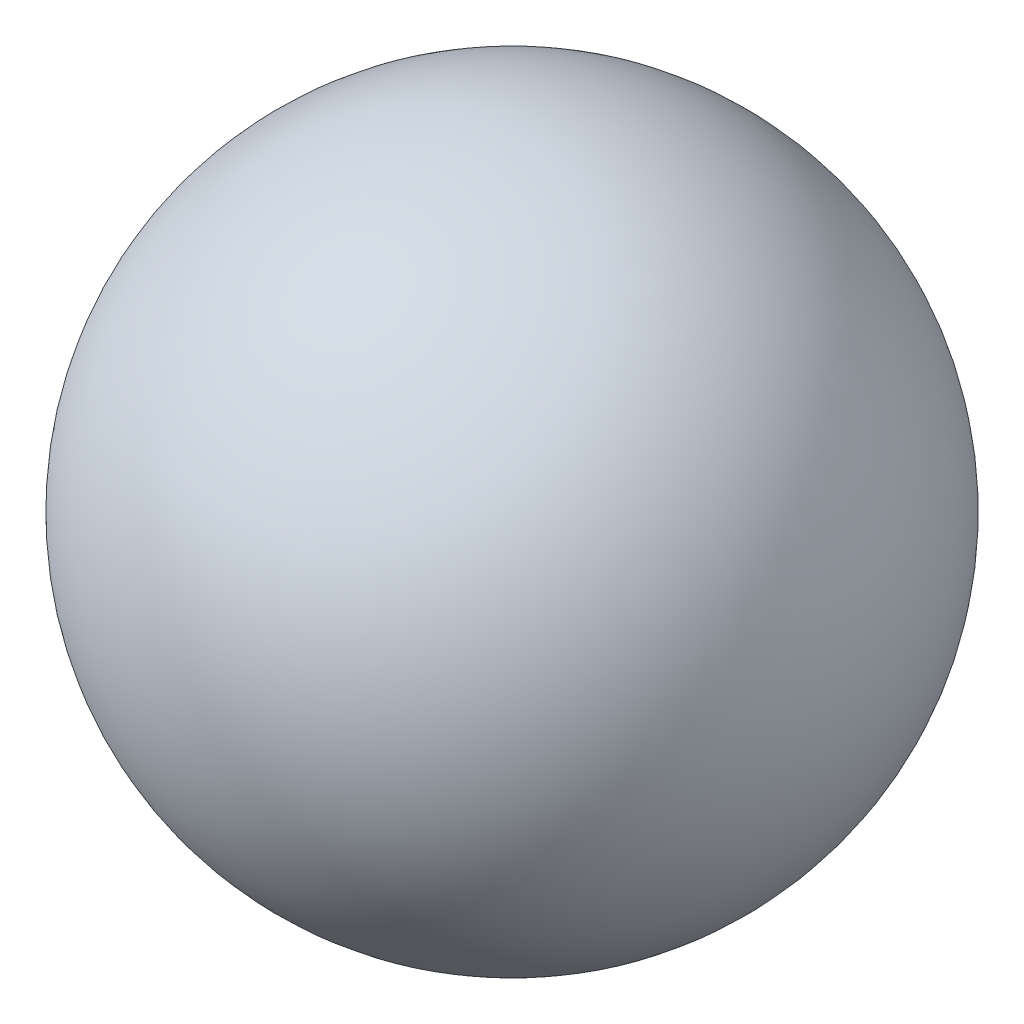
ISO-10303-21;
HEADER;
FILE_DESCRIPTION(('STEP AP214'),'2;1');
FILE_NAME('part.step','',(''),(''),'','','');
FILE_SCHEMA(('AUTOMOTIVE_DESIGN { 1 0 10303 214 1 1 1 1 }'));
ENDSEC;
DATA;
#1=APPLICATION_CONTEXT('core data for automotive mechanical design processes');
#2=APPLICATION_PROTOCOL_DEFINITION('international standard','automotive_design',2000,#1);
#3=PRODUCT_CONTEXT('',#1,'mechanical');
#4=PRODUCT('Part','Part','',(#3));
#5=PRODUCT_RELATED_PRODUCT_CATEGORY('part','',(#4));
#6=PRODUCT_DEFINITION_FORMATION('','',#4);
#7=PRODUCT_DEFINITION_CONTEXT('part definition',#1,'design');
#8=PRODUCT_DEFINITION('design','',#6,#7);
#9=PRODUCT_DEFINITION_SHAPE('','',#8);
#10=(LENGTH_UNIT() NAMED_UNIT(*) SI_UNIT(.MILLI.,.METRE.));
#11=(NAMED_UNIT(*) PLANE_ANGLE_UNIT() SI_UNIT($,.RADIAN.));
#12=(NAMED_UNIT(*) SI_UNIT($,.STERADIAN.) SOLID_ANGLE_UNIT());
#13=UNCERTAINTY_MEASURE_WITH_UNIT(LENGTH_MEASURE(1.E-05),#10,'distance_accuracy_value','');
#14=(GEOMETRIC_REPRESENTATION_CONTEXT(3) GLOBAL_UNCERTAINTY_ASSIGNED_CONTEXT((#13)) GLOBAL_UNIT_ASSIGNED_CONTEXT((#10,
#11,#12)) REPRESENTATION_CONTEXT('',''));
#15=CARTESIAN_POINT('',(0.,0.,0.));
#16=DIRECTION('',(0.,0.,1.));
#17=DIRECTION('',(1.,0.,0.));
#18=AXIS2_PLACEMENT_3D('',#15,#16,#17);
#19=CARTESIAN_POINT('',(0.,0.,0.));
#20=DIRECTION('',(0.,1.,0.));
#21=DIRECTION('',(1.,0.,0.));
#22=AXIS2_PLACEMENT_3D('',#19,#20,#21);
#23=SPHERICAL_SURFACE('',#22,9.);
#24=CARTESIAN_POINT('',(0.,9.,0.));
#25=VERTEX_POINT('',#24);
#26=VERTEX_LOOP('',#25);
#27=FACE_BOUND('',#26,.T.);
#28=ADVANCED_FACE('F28',(#27),#23,.T.);
#29=CLOSED_SHELL('',(#28));
#30=MANIFOLD_SOLID_BREP('B2',#29);
#31=ADVANCED_BREP_SHAPE_REPRESENTATION('',(#18,#30),#14);
#32=SHAPE_DEFINITION_REPRESENTATION(#9,#31);
ENDSEC;
END-ISO-10303-21;
